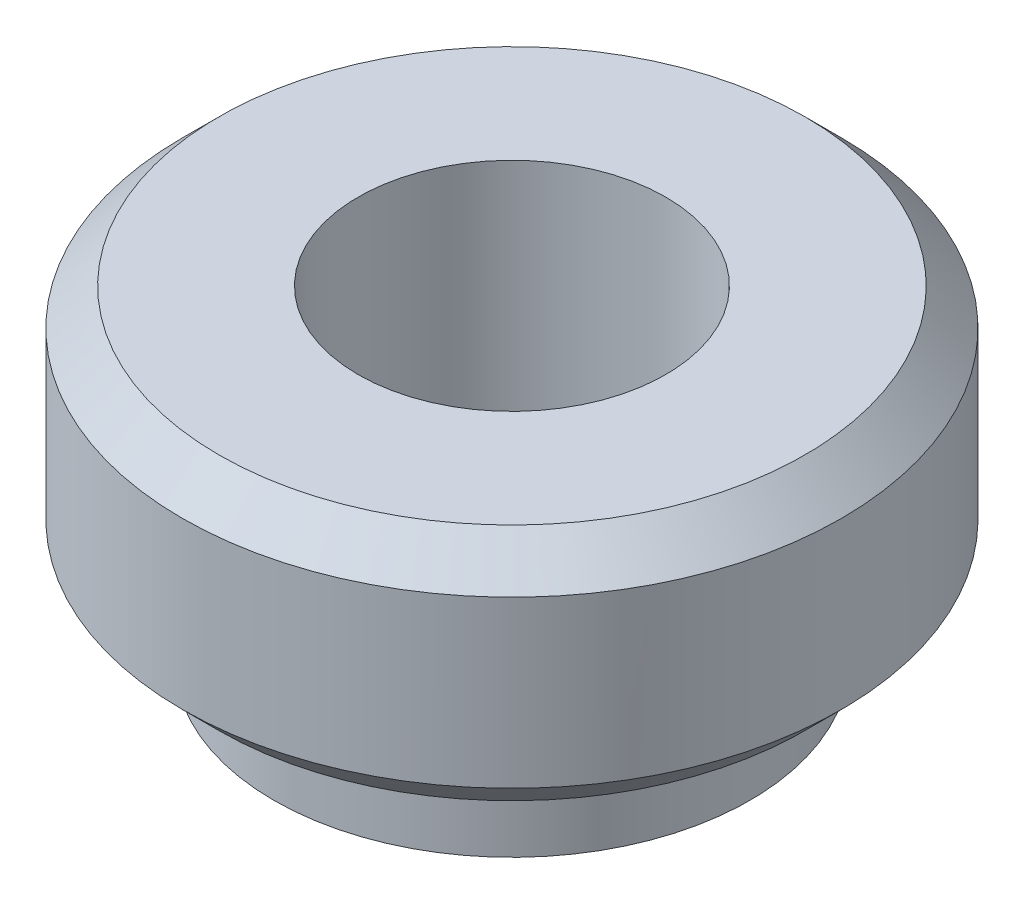
ISO-10303-21;
HEADER;
FILE_DESCRIPTION(('STEP AP214'),'2;1');
FILE_NAME('part.step','',(''),(''),'','','');
FILE_SCHEMA(('AUTOMOTIVE_DESIGN { 1 0 10303 214 1 1 1 1 }'));
ENDSEC;
DATA;
#1=APPLICATION_CONTEXT('core data for automotive mechanical design processes');
#2=APPLICATION_PROTOCOL_DEFINITION('international standard','automotive_design',2000,#1);
#3=PRODUCT_CONTEXT('',#1,'mechanical');
#4=PRODUCT('Part','Part','',(#3));
#5=PRODUCT_RELATED_PRODUCT_CATEGORY('part','',(#4));
#6=PRODUCT_DEFINITION_FORMATION('','',#4);
#7=PRODUCT_DEFINITION_CONTEXT('part definition',#1,'design');
#8=PRODUCT_DEFINITION('design','',#6,#7);
#9=PRODUCT_DEFINITION_SHAPE('','',#8);
#10=(LENGTH_UNIT() NAMED_UNIT(*) SI_UNIT(.MILLI.,.METRE.));
#11=(NAMED_UNIT(*) PLANE_ANGLE_UNIT() SI_UNIT($,.RADIAN.));
#12=(NAMED_UNIT(*) SI_UNIT($,.STERADIAN.) SOLID_ANGLE_UNIT());
#13=UNCERTAINTY_MEASURE_WITH_UNIT(LENGTH_MEASURE(1.E-05),#10,'distance_accuracy_value','');
#14=(GEOMETRIC_REPRESENTATION_CONTEXT(3) GLOBAL_UNCERTAINTY_ASSIGNED_CONTEXT((#13)) GLOBAL_UNIT_ASSIGNED_CONTEXT((#10,
#11,#12)) REPRESENTATION_CONTEXT('',''));
#15=CARTESIAN_POINT('',(0.,0.,0.));
#16=DIRECTION('',(0.,0.,1.));
#17=DIRECTION('',(1.,0.,0.));
#18=AXIS2_PLACEMENT_3D('',#15,#16,#17);
#19=CARTESIAN_POINT('',(0.,0.84,0.));
#20=DIRECTION('',(0.,1.,0.));
#21=DIRECTION('',(0.,0.,1.));
#22=AXIS2_PLACEMENT_3D('',#19,#20,#21);
#23=PLANE('',#22);
#24=CARTESIAN_POINT('',(0.,0.839999999851,0.));
#25=DIRECTION('',(0.,1.,0.));
#26=DIRECTION('',(0.,0.,1.));
#27=AXIS2_PLACEMENT_3D('',#24,#25,#26);
#28=CIRCLE('',#27,3.25);
#29=CARTESIAN_POINT('',(0.,0.839999999851,3.25));
#30=VERTEX_POINT('',#29);
#31=EDGE_CURVE('E38',#30,#30,#28,.F.);
#32=ORIENTED_EDGE('',*,*,#31,.F.);
#33=EDGE_LOOP('',(#32));
#34=FACE_BOUND('',#33,.T.);
#35=CARTESIAN_POINT('',(0.,0.840000000039254,0.));
#36=DIRECTION('',(0.,1.,0.));
#37=DIRECTION('',(0.,0.,1.));
#38=AXIS2_PLACEMENT_3D('',#35,#36,#37);
#39=CIRCLE('',#38,4.0000000000191);
#40=CARTESIAN_POINT('',(0.,0.840000000039254,4.0000000000191));
#41=VERTEX_POINT('',#40);
#42=EDGE_CURVE('E18',#41,#41,#39,.T.);
#43=ORIENTED_EDGE('',*,*,#42,.F.);
#44=EDGE_LOOP('',(#43));
#45=FACE_BOUND('',#44,.T.);
#46=ADVANCED_FACE('F15',(#34,#45),#23,.F.);
#47=CARTESIAN_POINT('',(0.,1.34000000002743,0.));
#48=DIRECTION('',(0.,1.,0.));
#49=DIRECTION('',(0.,0.,1.));
#50=AXIS2_PLACEMENT_3D('',#47,#48,#49);
#51=CONICAL_SURFACE('',#50,4.50000000000728,0.785398163397448);
#52=ORIENTED_EDGE('',*,*,#42,.T.);
#53=EDGE_LOOP('',(#52));
#54=FACE_BOUND('',#53,.T.);
#55=CARTESIAN_POINT('',(0.,1.34,0.));
#56=DIRECTION('',(0.,1.,0.));
#57=DIRECTION('',(0.,0.,1.));
#58=AXIS2_PLACEMENT_3D('',#55,#56,#57);
#59=CIRCLE('',#58,4.5);
#60=CARTESIAN_POINT('',(0.,1.34,4.5));
#61=VERTEX_POINT('',#60);
#62=EDGE_CURVE('E30',#61,#61,#59,.T.);
#63=ORIENTED_EDGE('',*,*,#62,.F.);
#64=EDGE_LOOP('',(#63));
#65=FACE_BOUND('',#64,.T.);
#66=ADVANCED_FACE('F46',(#54,#65),#51,.T.);
#67=CARTESIAN_POINT('',(0.,0.,0.));
#68=DIRECTION('',(0.,1.,0.));
#69=DIRECTION('',(0.,0.,1.));
#70=AXIS2_PLACEMENT_3D('',#67,#68,#69);
#71=CYLINDRICAL_SURFACE('',#70,3.25);
#72=CARTESIAN_POINT('',(0.,-0.36,0.));
#73=DIRECTION('',(0.,1.,0.));
#74=DIRECTION('',(0.,0.,1.));
#75=AXIS2_PLACEMENT_3D('',#72,#73,#74);
#76=CIRCLE('',#75,3.25);
#77=CARTESIAN_POINT('',(0.,-0.36,3.25));
#78=VERTEX_POINT('',#77);
#79=EDGE_CURVE('E36',#78,#78,#76,.T.);
#80=ORIENTED_EDGE('',*,*,#79,.T.);
#81=EDGE_LOOP('',(#80));
#82=FACE_BOUND('',#81,.T.);
#83=ORIENTED_EDGE('',*,*,#31,.T.);
#84=EDGE_LOOP('',(#83));
#85=FACE_BOUND('',#84,.T.);
#86=ADVANCED_FACE('F55',(#82,#85),#71,.T.);
#87=CARTESIAN_POINT('',(0.,1.5,0.));
#88=DIRECTION('',(0.,1.,0.));
#89=DIRECTION('',(0.,0.,1.));
#90=AXIS2_PLACEMENT_3D('',#87,#88,#89);
#91=CYLINDRICAL_SURFACE('',#90,4.5);
#92=ORIENTED_EDGE('',*,*,#62,.T.);
#93=EDGE_LOOP('',(#92));
#94=FACE_BOUND('',#93,.T.);
#95=CARTESIAN_POINT('',(0.,3.60000000000582,0.));
#96=DIRECTION('',(0.,-1.,0.));
#97=DIRECTION('',(0.,0.,-1.));
#98=AXIS2_PLACEMENT_3D('',#95,#96,#97);
#99=CIRCLE('',#98,4.50000000000728);
#100=CARTESIAN_POINT('',(0.,3.60000000000582,-4.50000000000728));
#101=VERTEX_POINT('',#100);
#102=EDGE_CURVE('E35',#101,#101,#99,.F.);
#103=ORIENTED_EDGE('',*,*,#102,.F.);
#104=EDGE_LOOP('',(#103));
#105=FACE_BOUND('',#104,.T.);
#106=ADVANCED_FACE('F74',(#94,#105),#91,.T.);
#107=CARTESIAN_POINT('',(0.,-0.36,0.));
#108=DIRECTION('',(0.,1.,0.));
#109=DIRECTION('',(0.,0.,1.));
#110=AXIS2_PLACEMENT_3D('',#107,#108,#109);
#111=PLANE('',#110);
#112=CARTESIAN_POINT('',(0.,-0.36,0.));
#113=DIRECTION('',(0.,1.,0.));
#114=DIRECTION('',(0.,0.,1.));
#115=AXIS2_PLACEMENT_3D('',#112,#113,#114);
#116=CIRCLE('',#115,2.1);
#117=CARTESIAN_POINT('',(0.,-0.36,2.1));
#118=VERTEX_POINT('',#117);
#119=EDGE_CURVE('E27',#118,#118,#116,.T.);
#120=ORIENTED_EDGE('',*,*,#119,.T.);
#121=EDGE_LOOP('',(#120));
#122=FACE_BOUND('',#121,.T.);
#123=ORIENTED_EDGE('',*,*,#79,.F.);
#124=EDGE_LOOP('',(#123));
#125=FACE_BOUND('',#124,.T.);
#126=ADVANCED_FACE('F70',(#122,#125),#111,.F.);
#127=CARTESIAN_POINT('',(0.,3.60000000000582,0.));
#128=DIRECTION('',(0.,-1.,0.));
#129=DIRECTION('',(0.,0.,-1.));
#130=AXIS2_PLACEMENT_3D('',#127,#128,#129);
#131=CONICAL_SURFACE('',#130,4.50000000000728,0.785398163397448);
#132=ORIENTED_EDGE('',*,*,#102,.T.);
#133=EDGE_LOOP('',(#132));
#134=FACE_BOUND('',#133,.T.);
#135=CARTESIAN_POINT('',(0.,4.099999999994,0.));
#136=DIRECTION('',(0.,-1.,0.));
#137=DIRECTION('',(0.,0.,-1.));
#138=AXIS2_PLACEMENT_3D('',#135,#136,#137);
#139=CIRCLE('',#138,4.0000000000191);
#140=CARTESIAN_POINT('',(0.,4.099999999994,-4.0000000000191));
#141=VERTEX_POINT('',#140);
#142=EDGE_CURVE('E22',#141,#141,#139,.F.);
#143=ORIENTED_EDGE('',*,*,#142,.F.);
#144=EDGE_LOOP('',(#143));
#145=FACE_BOUND('',#144,.T.);
#146=ADVANCED_FACE('F63',(#134,#145),#131,.T.);
#147=CARTESIAN_POINT('',(0.,0.,0.));
#148=DIRECTION('',(0.,1.,0.));
#149=DIRECTION('',(0.,0.,1.));
#150=AXIS2_PLACEMENT_3D('',#147,#148,#149);
#151=CYLINDRICAL_SURFACE('',#150,2.1);
#152=CARTESIAN_POINT('',(0.,4.1,0.));
#153=DIRECTION('',(0.,1.,0.));
#154=DIRECTION('',(0.,0.,1.));
#155=AXIS2_PLACEMENT_3D('',#152,#153,#154);
#156=CIRCLE('',#155,2.1);
#157=CARTESIAN_POINT('',(0.,4.1,2.1));
#158=VERTEX_POINT('',#157);
#159=EDGE_CURVE('E10',#158,#158,#156,.F.);
#160=ORIENTED_EDGE('',*,*,#159,.F.);
#161=EDGE_LOOP('',(#160));
#162=FACE_BOUND('',#161,.T.);
#163=ORIENTED_EDGE('',*,*,#119,.F.);
#164=EDGE_LOOP('',(#163));
#165=FACE_BOUND('',#164,.T.);
#166=ADVANCED_FACE('F58',(#162,#165),#151,.F.);
#167=CARTESIAN_POINT('',(0.,4.1,0.));
#168=DIRECTION('',(0.,1.,0.));
#169=DIRECTION('',(0.,0.,1.));
#170=AXIS2_PLACEMENT_3D('',#167,#168,#169);
#171=PLANE('',#170);
#172=ORIENTED_EDGE('',*,*,#159,.T.);
#173=EDGE_LOOP('',(#172));
#174=FACE_BOUND('',#173,.T.);
#175=ORIENTED_EDGE('',*,*,#142,.T.);
#176=EDGE_LOOP('',(#175));
#177=FACE_BOUND('',#176,.T.);
#178=ADVANCED_FACE('F56',(#174,#177),#171,.T.);
#179=CLOSED_SHELL('',(#46,#66,#86,#106,#126,#146,#166,#178));
#180=MANIFOLD_SOLID_BREP('B1',#179);
#181=ADVANCED_BREP_SHAPE_REPRESENTATION('',(#18,#180),#14);
#182=SHAPE_DEFINITION_REPRESENTATION(#9,#181);
ENDSEC;
END-ISO-10303-21;
